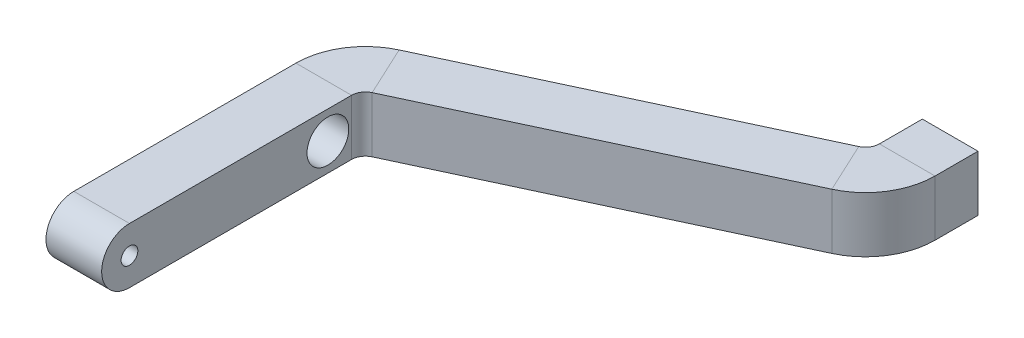
ISO-10303-21;
HEADER;
FILE_DESCRIPTION(('STEP AP214'),'2;1');
FILE_NAME('part.step','',(''),(''),'','','');
FILE_SCHEMA(('AUTOMOTIVE_DESIGN { 1 0 10303 214 1 1 1 1 }'));
ENDSEC;
DATA;
#1=APPLICATION_CONTEXT('core data for automotive mechanical design processes');
#2=APPLICATION_PROTOCOL_DEFINITION('international standard','automotive_design',2000,#1);
#3=PRODUCT_CONTEXT('',#1,'mechanical');
#4=PRODUCT('Part','Part','',(#3));
#5=PRODUCT_RELATED_PRODUCT_CATEGORY('part','',(#4));
#6=PRODUCT_DEFINITION_FORMATION('','',#4);
#7=PRODUCT_DEFINITION_CONTEXT('part definition',#1,'design');
#8=PRODUCT_DEFINITION('design','',#6,#7);
#9=PRODUCT_DEFINITION_SHAPE('','',#8);
#10=(LENGTH_UNIT() NAMED_UNIT(*) SI_UNIT(.MILLI.,.METRE.));
#11=(NAMED_UNIT(*) PLANE_ANGLE_UNIT() SI_UNIT($,.RADIAN.));
#12=(NAMED_UNIT(*) SI_UNIT($,.STERADIAN.) SOLID_ANGLE_UNIT());
#13=UNCERTAINTY_MEASURE_WITH_UNIT(LENGTH_MEASURE(1.E-05),#10,'distance_accuracy_value','');
#14=(GEOMETRIC_REPRESENTATION_CONTEXT(3) GLOBAL_UNCERTAINTY_ASSIGNED_CONTEXT((#13)) GLOBAL_UNIT_ASSIGNED_CONTEXT((#10,
#11,#12)) REPRESENTATION_CONTEXT('',''));
#15=CARTESIAN_POINT('',(0.,0.,0.));
#16=DIRECTION('',(0.,0.,1.));
#17=DIRECTION('',(1.,0.,0.));
#18=AXIS2_PLACEMENT_3D('',#15,#16,#17);
#19=CARTESIAN_POINT('',(-280.,0.,350.));
#20=DIRECTION('',(-1.,0.,0.));
#21=DIRECTION('',(0.,0.,1.));
#22=AXIS2_PLACEMENT_3D('',#19,#20,#21);
#23=CYLINDRICAL_SURFACE('',#22,20.);
#24=DIRECTION('',(-1.,0.,0.));
#25=VECTOR('',#24,1.);
#26=CARTESIAN_POINT('',(-280.,20.,350.));
#27=LINE('',#26,#25);
#28=CARTESIAN_POINT('',(-280.,20.,350.));
#29=VERTEX_POINT('',#28);
#30=CARTESIAN_POINT('',(-240.,20.,350.));
#31=VERTEX_POINT('',#30);
#32=EDGE_CURVE('E245',#29,#31,#27,.F.);
#33=ORIENTED_EDGE('',*,*,#32,.F.);
#34=CARTESIAN_POINT('',(-280.,0.,350.));
#35=DIRECTION('',(-1.,0.,0.));
#36=DIRECTION('',(0.,0.,1.));
#37=AXIS2_PLACEMENT_3D('',#34,#35,#36);
#38=CIRCLE('',#37,20.);
#39=CARTESIAN_POINT('',(-280.,-20.,350.));
#40=VERTEX_POINT('',#39);
#41=EDGE_CURVE('E46',#40,#29,#38,.T.);
#42=ORIENTED_EDGE('',*,*,#41,.F.);
#43=DIRECTION('',(-1.,0.,0.));
#44=VECTOR('',#43,1.);
#45=CARTESIAN_POINT('',(-280.,-20.,350.));
#46=LINE('',#45,#44);
#47=CARTESIAN_POINT('',(-240.,-20.,350.));
#48=VERTEX_POINT('',#47);
#49=EDGE_CURVE('E257',#48,#40,#46,.T.);
#50=ORIENTED_EDGE('',*,*,#49,.F.);
#51=CARTESIAN_POINT('',(-240.,0.,350.));
#52=DIRECTION('',(1.,0.,0.));
#53=DIRECTION('',(0.,0.,-1.));
#54=AXIS2_PLACEMENT_3D('',#51,#52,#53);
#55=CIRCLE('',#54,20.);
#56=EDGE_CURVE('E11',#31,#48,#55,.T.);
#57=ORIENTED_EDGE('',*,*,#56,.F.);
#58=EDGE_LOOP('',(#33,#42,#50,#57));
#59=FACE_BOUND('',#58,.T.);
#60=ADVANCED_FACE('F37',(#59),#23,.T.);
#61=CARTESIAN_POINT('',(0.,0.,0.));
#62=DIRECTION('',(0.,0.,1.));
#63=DIRECTION('',(1.,0.,0.));
#64=AXIS2_PLACEMENT_3D('',#61,#62,#63);
#65=PLANE('',#64);
#66=CARTESIAN_POINT('',(0.,0.,0.));
#67=DIRECTION('',(0.,0.,-1.));
#68=DIRECTION('',(-1.,0.,0.));
#69=AXIS2_PLACEMENT_3D('',#66,#67,#68);
#70=CIRCLE('',#69,10.);
#71=CARTESIAN_POINT('',(-10.,0.,0.));
#72=VERTEX_POINT('',#71);
#73=EDGE_CURVE('E269',#72,#72,#70,.T.);
#74=ORIENTED_EDGE('',*,*,#73,.F.);
#75=EDGE_LOOP('',(#74));
#76=FACE_BOUND('',#75,.T.);
#77=DIRECTION('',(0.,1.,0.));
#78=VECTOR('',#77,1.);
#79=CARTESIAN_POINT('',(20.,20.,0.));
#80=LINE('',#79,#78);
#81=CARTESIAN_POINT('',(20.,-20.,0.));
#82=VERTEX_POINT('',#81);
#83=CARTESIAN_POINT('',(20.,20.,0.));
#84=VERTEX_POINT('',#83);
#85=EDGE_CURVE('E145',#82,#84,#80,.T.);
#86=ORIENTED_EDGE('',*,*,#85,.F.);
#87=DIRECTION('',(1.,0.,0.));
#88=VECTOR('',#87,1.);
#89=CARTESIAN_POINT('',(-20.,-20.,0.));
#90=LINE('',#89,#88);
#91=CARTESIAN_POINT('',(-20.,-20.,0.));
#92=VERTEX_POINT('',#91);
#93=EDGE_CURVE('E130',#92,#82,#90,.T.);
#94=ORIENTED_EDGE('',*,*,#93,.F.);
#95=DIRECTION('',(0.,-1.,0.));
#96=VECTOR('',#95,1.);
#97=CARTESIAN_POINT('',(-20.,20.,0.));
#98=LINE('',#97,#96);
#99=CARTESIAN_POINT('',(-20.,20.,0.));
#100=VERTEX_POINT('',#99);
#101=EDGE_CURVE('E124',#100,#92,#98,.T.);
#102=ORIENTED_EDGE('',*,*,#101,.F.);
#103=DIRECTION('',(-1.,0.,0.));
#104=VECTOR('',#103,1.);
#105=CARTESIAN_POINT('',(-20.,20.,0.));
#106=LINE('',#105,#104);
#107=EDGE_CURVE('E127',#84,#100,#106,.T.);
#108=ORIENTED_EDGE('',*,*,#107,.F.);
#109=EDGE_LOOP('',(#86,#94,#102,#108));
#110=FACE_BOUND('',#109,.T.);
#111=ADVANCED_FACE('F126',(#76,#110),#65,.F.);
#112=CARTESIAN_POINT('',(-20.,20.,0.));
#113=DIRECTION('',(-1.,0.,0.));
#114=DIRECTION('',(0.,-1.,0.));
#115=AXIS2_PLACEMENT_3D('',#112,#113,#114);
#116=PLANE('',#115);
#117=DIRECTION('',(0.,0.,1.));
#118=VECTOR('',#117,1.);
#119=CARTESIAN_POINT('',(-20.,-20.,0.));
#120=LINE('',#119,#118);
#121=CARTESIAN_POINT('',(-20.,-20.,30.8878921757752));
#122=VERTEX_POINT('',#121);
#123=EDGE_CURVE('E152',#92,#122,#120,.T.);
#124=ORIENTED_EDGE('',*,*,#123,.T.);
#125=DIRECTION('',(0.,-1.,0.));
#126=VECTOR('',#125,1.);
#127=CARTESIAN_POINT('',(-20.,20.,30.8878921757752));
#128=LINE('',#127,#126);
#129=CARTESIAN_POINT('',(-20.,20.,30.8878921757752));
#130=VERTEX_POINT('',#129);
#131=EDGE_CURVE('E150',#130,#122,#128,.T.);
#132=ORIENTED_EDGE('',*,*,#131,.F.);
#133=DIRECTION('',(0.,0.,1.));
#134=VECTOR('',#133,1.);
#135=CARTESIAN_POINT('',(-20.,20.,0.));
#136=LINE('',#135,#134);
#137=EDGE_CURVE('E142',#100,#130,#136,.T.);
#138=ORIENTED_EDGE('',*,*,#137,.F.);
#139=ORIENTED_EDGE('',*,*,#101,.T.);
#140=EDGE_LOOP('',(#124,#132,#138,#139));
#141=FACE_BOUND('',#140,.T.);
#142=ADVANCED_FACE('F148',(#141),#116,.T.);
#143=CARTESIAN_POINT('',(-20.,-20.,0.));
#144=DIRECTION('',(0.,-1.,0.));
#145=DIRECTION('',(0.,0.,-1.));
#146=AXIS2_PLACEMENT_3D('',#143,#144,#145);
#147=PLANE('',#146);
#148=DIRECTION('',(0.,0.,1.));
#149=VECTOR('',#148,1.);
#150=CARTESIAN_POINT('',(20.,-20.,0.));
#151=LINE('',#150,#149);
#152=CARTESIAN_POINT('',(20.,-20.,30.8878921757752));
#153=VERTEX_POINT('',#152);
#154=EDGE_CURVE('E201',#82,#153,#151,.T.);
#155=ORIENTED_EDGE('',*,*,#154,.T.);
#156=DIRECTION('',(1.,0.,0.));
#157=VECTOR('',#156,1.);
#158=CARTESIAN_POINT('',(-20.,-20.,30.8878921757752));
#159=LINE('',#158,#157);
#160=EDGE_CURVE('E198',#122,#153,#159,.T.);
#161=ORIENTED_EDGE('',*,*,#160,.F.);
#162=ORIENTED_EDGE('',*,*,#123,.F.);
#163=ORIENTED_EDGE('',*,*,#93,.T.);
#164=EDGE_LOOP('',(#155,#161,#162,#163));
#165=FACE_BOUND('',#164,.T.);
#166=ADVANCED_FACE('F362',(#165),#147,.T.);
#167=CARTESIAN_POINT('',(20.,20.,0.));
#168=DIRECTION('',(1.,0.,0.));
#169=DIRECTION('',(0.,0.,-1.));
#170=AXIS2_PLACEMENT_3D('',#167,#168,#169);
#171=PLANE('',#170);
#172=DIRECTION('',(0.,0.,1.));
#173=VECTOR('',#172,1.);
#174=CARTESIAN_POINT('',(20.,20.,0.));
#175=LINE('',#174,#173);
#176=CARTESIAN_POINT('',(20.,20.,30.8878921757752));
#177=VERTEX_POINT('',#176);
#178=EDGE_CURVE('E144',#84,#177,#175,.T.);
#179=ORIENTED_EDGE('',*,*,#178,.T.);
#180=DIRECTION('',(0.,1.,0.));
#181=VECTOR('',#180,1.);
#182=CARTESIAN_POINT('',(20.,20.,30.8878921757752));
#183=LINE('',#182,#181);
#184=EDGE_CURVE('E204',#153,#177,#183,.T.);
#185=ORIENTED_EDGE('',*,*,#184,.F.);
#186=ORIENTED_EDGE('',*,*,#154,.F.);
#187=ORIENTED_EDGE('',*,*,#85,.T.);
#188=EDGE_LOOP('',(#179,#185,#186,#187));
#189=FACE_BOUND('',#188,.T.);
#190=ADVANCED_FACE('F352',(#189),#171,.T.);
#191=CARTESIAN_POINT('',(-20.,20.,0.));
#192=DIRECTION('',(0.,1.,0.));
#193=DIRECTION('',(0.,0.,1.));
#194=AXIS2_PLACEMENT_3D('',#191,#192,#193);
#195=PLANE('',#194);
#196=DIRECTION('',(-1.,0.,0.));
#197=VECTOR('',#196,1.);
#198=CARTESIAN_POINT('',(-20.,20.,30.8878921757752));
#199=LINE('',#198,#197);
#200=EDGE_CURVE('E166',#177,#130,#199,.T.);
#201=ORIENTED_EDGE('',*,*,#200,.F.);
#202=ORIENTED_EDGE('',*,*,#178,.F.);
#203=ORIENTED_EDGE('',*,*,#107,.T.);
#204=ORIENTED_EDGE('',*,*,#137,.T.);
#205=EDGE_LOOP('',(#201,#202,#203,#204));
#206=FACE_BOUND('',#205,.T.);
#207=ADVANCED_FACE('F141',(#206),#195,.T.);
#208=CARTESIAN_POINT('',(-30.,0.,30.8878921757752));
#209=DIRECTION('',(0.,-1.,0.));
#210=DIRECTION('',(0.,0.,-1.));
#211=AXIS2_PLACEMENT_3D('',#208,#209,#210);
#212=CYLINDRICAL_SURFACE('',#211,10.);
#213=CARTESIAN_POINT('',(-30.,-20.,30.8878921757752));
#214=DIRECTION('',(0.,-1.,0.));
#215=DIRECTION('',(1.,0.,0.));
#216=AXIS2_PLACEMENT_3D('',#213,#214,#215);
#217=CIRCLE('',#216,10.);
#218=CARTESIAN_POINT('',(-25.773817382593,-20.,39.9509700461417));
#219=VERTEX_POINT('',#218);
#220=EDGE_CURVE('E159',#122,#219,#217,.T.);
#221=ORIENTED_EDGE('',*,*,#220,.T.);
#222=DIRECTION('',(0.,-1.,0.));
#223=VECTOR('',#222,1.);
#224=CARTESIAN_POINT('',(-25.773817382593,20.,39.9509700461417));
#225=LINE('',#224,#223);
#226=CARTESIAN_POINT('',(-25.773817382593,20.,39.9509700461417));
#227=VERTEX_POINT('',#226);
#228=EDGE_CURVE('E156',#227,#219,#225,.T.);
#229=ORIENTED_EDGE('',*,*,#228,.F.);
#230=CARTESIAN_POINT('',(-30.,20.,30.8878921757752));
#231=DIRECTION('',(0.,-1.,0.));
#232=DIRECTION('',(1.,0.,0.));
#233=AXIS2_PLACEMENT_3D('',#230,#231,#232);
#234=CIRCLE('',#233,9.99999999999999);
#235=EDGE_CURVE('E160',#130,#227,#234,.T.);
#236=ORIENTED_EDGE('',*,*,#235,.F.);
#237=ORIENTED_EDGE('',*,*,#131,.T.);
#238=EDGE_LOOP('',(#221,#229,#236,#237));
#239=FACE_BOUND('',#238,.T.);
#240=ADVANCED_FACE('F351',(#239),#212,.F.);
#241=CARTESIAN_POINT('',(-20.,-20.,30.8878921757752));
#242=DIRECTION('',(0.,-1.,0.));
#243=DIRECTION('',(0.,0.,-1.));
#244=AXIS2_PLACEMENT_3D('',#241,#242,#243);
#245=PLANE('',#244);
#246=CARTESIAN_POINT('',(-30.,-20.,30.8878921757752));
#247=DIRECTION('',(0.,-1.,0.));
#248=DIRECTION('',(1.,0.,0.));
#249=AXIS2_PLACEMENT_3D('',#246,#247,#248);
#250=CIRCLE('',#249,50.);
#251=CARTESIAN_POINT('',(-8.86908691296514,-20.,76.2032815276077));
#252=VERTEX_POINT('',#251);
#253=EDGE_CURVE('E207',#153,#252,#250,.T.);
#254=ORIENTED_EDGE('',*,*,#253,.T.);
#255=DIRECTION('',(0.422618261740697,0.,0.906307787036651));
#256=VECTOR('',#255,1.);
#257=CARTESIAN_POINT('',(-25.773817382593,-20.,39.9509700461417));
#258=LINE('',#257,#256);
#259=EDGE_CURVE('E163',#219,#252,#258,.T.);
#260=ORIENTED_EDGE('',*,*,#259,.F.);
#261=ORIENTED_EDGE('',*,*,#220,.F.);
#262=ORIENTED_EDGE('',*,*,#160,.T.);
#263=EDGE_LOOP('',(#254,#260,#261,#262));
#264=FACE_BOUND('',#263,.T.);
#265=ADVANCED_FACE('F359',(#264),#245,.T.);
#266=CARTESIAN_POINT('',(-30.,0.,30.8878921757752));
#267=DIRECTION('',(0.,-1.,0.));
#268=DIRECTION('',(0.,0.,-1.));
#269=AXIS2_PLACEMENT_3D('',#266,#267,#268);
#270=CYLINDRICAL_SURFACE('',#269,50.);
#271=CARTESIAN_POINT('',(-30.,20.,30.8878921757752));
#272=DIRECTION('',(0.,-1.,0.));
#273=DIRECTION('',(1.,0.,0.));
#274=AXIS2_PLACEMENT_3D('',#271,#272,#273);
#275=CIRCLE('',#274,50.);
#276=CARTESIAN_POINT('',(-8.86908691296513,20.,76.2032815276077));
#277=VERTEX_POINT('',#276);
#278=EDGE_CURVE('E232',#177,#277,#275,.T.);
#279=ORIENTED_EDGE('',*,*,#278,.T.);
#280=DIRECTION('',(0.,1.,0.));
#281=VECTOR('',#280,1.);
#282=CARTESIAN_POINT('',(-8.86908691296514,20.,76.2032815276077));
#283=LINE('',#282,#281);
#284=EDGE_CURVE('E210',#252,#277,#283,.T.);
#285=ORIENTED_EDGE('',*,*,#284,.F.);
#286=ORIENTED_EDGE('',*,*,#253,.F.);
#287=ORIENTED_EDGE('',*,*,#184,.T.);
#288=EDGE_LOOP('',(#279,#285,#286,#287));
#289=FACE_BOUND('',#288,.T.);
#290=ADVANCED_FACE('F348',(#289),#270,.T.);
#291=CARTESIAN_POINT('',(-20.,20.,30.8878921757752));
#292=DIRECTION('',(0.,1.,0.));
#293=DIRECTION('',(0.,0.,1.));
#294=AXIS2_PLACEMENT_3D('',#291,#292,#293);
#295=PLANE('',#294);
#296=DIRECTION('',(-0.422618261740697,0.,-0.906307787036651));
#297=VECTOR('',#296,1.);
#298=CARTESIAN_POINT('',(-25.773817382593,20.,39.9509700461417));
#299=LINE('',#298,#297);
#300=EDGE_CURVE('E177',#277,#227,#299,.T.);
#301=ORIENTED_EDGE('',*,*,#300,.F.);
#302=ORIENTED_EDGE('',*,*,#278,.F.);
#303=ORIENTED_EDGE('',*,*,#200,.T.);
#304=ORIENTED_EDGE('',*,*,#235,.T.);
#305=EDGE_LOOP('',(#301,#302,#303,#304));
#306=FACE_BOUND('',#305,.T.);
#307=ADVANCED_FACE('F344',(#306),#295,.T.);
#308=CARTESIAN_POINT('',(-25.773817382593,20.,39.9509700461417));
#309=DIRECTION('',(-0.422618261740697,0.,-0.906307787036651));
#310=DIRECTION('',(-0.906307787036651,0.,0.422618261740697));
#311=AXIS2_PLACEMENT_3D('',#308,#309,#310);
#312=PLANE('',#311);
#313=DIRECTION('',(-0.906307787036651,0.,0.422618261740697));
#314=VECTOR('',#313,1.);
#315=CARTESIAN_POINT('',(-25.773817382593,-20.,39.9509700461417));
#316=LINE('',#315,#314);
#317=CARTESIAN_POINT('',(-251.130913087035,-20.,145.036709592691));
#318=VERTEX_POINT('',#317);
#319=EDGE_CURVE('E170',#219,#318,#316,.T.);
#320=ORIENTED_EDGE('',*,*,#319,.T.);
#321=DIRECTION('',(0.,-1.,0.));
#322=VECTOR('',#321,1.);
#323=CARTESIAN_POINT('',(-251.130913087035,20.,145.036709592691));
#324=LINE('',#323,#322);
#325=CARTESIAN_POINT('',(-251.130913087035,20.,145.036709592691));
#326=VERTEX_POINT('',#325);
#327=EDGE_CURVE('E167',#326,#318,#324,.T.);
#328=ORIENTED_EDGE('',*,*,#327,.F.);
#329=DIRECTION('',(-0.906307787036651,0.,0.422618261740697));
#330=VECTOR('',#329,1.);
#331=CARTESIAN_POINT('',(-25.773817382593,20.,39.9509700461417));
#332=LINE('',#331,#330);
#333=EDGE_CURVE('E171',#227,#326,#332,.T.);
#334=ORIENTED_EDGE('',*,*,#333,.F.);
#335=ORIENTED_EDGE('',*,*,#228,.T.);
#336=EDGE_LOOP('',(#320,#328,#334,#335));
#337=FACE_BOUND('',#336,.T.);
#338=ADVANCED_FACE('F347',(#337),#312,.T.);
#339=CARTESIAN_POINT('',(-25.773817382593,-20.,39.9509700461417));
#340=DIRECTION('',(0.,-1.,0.));
#341=DIRECTION('',(0.,0.,-1.));
#342=AXIS2_PLACEMENT_3D('',#339,#340,#341);
#343=PLANE('',#342);
#344=DIRECTION('',(-0.906307787036651,0.,0.422618261740697));
#345=VECTOR('',#344,1.);
#346=CARTESIAN_POINT('',(-8.86908691296514,-20.,76.2032815276077));
#347=LINE('',#346,#345);
#348=CARTESIAN_POINT('',(-234.226182617407,-20.,181.289021074157));
#349=VERTEX_POINT('',#348);
#350=EDGE_CURVE('E213',#252,#349,#347,.T.);
#351=ORIENTED_EDGE('',*,*,#350,.T.);
#352=DIRECTION('',(0.422618261740697,0.,0.906307787036651));
#353=VECTOR('',#352,1.);
#354=CARTESIAN_POINT('',(-251.130913087035,-20.,145.036709592691));
#355=LINE('',#354,#353);
#356=EDGE_CURVE('E174',#318,#349,#355,.T.);
#357=ORIENTED_EDGE('',*,*,#356,.F.);
#358=ORIENTED_EDGE('',*,*,#319,.F.);
#359=ORIENTED_EDGE('',*,*,#259,.T.);
#360=EDGE_LOOP('',(#351,#357,#358,#359));
#361=FACE_BOUND('',#360,.T.);
#362=ADVANCED_FACE('F304',(#361),#343,.T.);
#363=CARTESIAN_POINT('',(-8.86908691296515,20.,76.2032815276077));
#364=DIRECTION('',(0.422618261740697,0.,0.906307787036651));
#365=DIRECTION('',(0.906307787036651,0.,-0.422618261740697));
#366=AXIS2_PLACEMENT_3D('',#363,#364,#365);
#367=PLANE('',#366);
#368=DIRECTION('',(-0.906307787036651,0.,0.422618261740697));
#369=VECTOR('',#368,1.);
#370=CARTESIAN_POINT('',(-8.86908691296515,20.,76.2032815276077));
#371=LINE('',#370,#369);
#372=CARTESIAN_POINT('',(-234.226182617407,20.,181.289021074157));
#373=VERTEX_POINT('',#372);
#374=EDGE_CURVE('E237',#277,#373,#371,.T.);
#375=ORIENTED_EDGE('',*,*,#374,.T.);
#376=DIRECTION('',(0.,1.,0.));
#377=VECTOR('',#376,1.);
#378=CARTESIAN_POINT('',(-234.226182617407,20.,181.289021074157));
#379=LINE('',#378,#377);
#380=EDGE_CURVE('E216',#349,#373,#379,.T.);
#381=ORIENTED_EDGE('',*,*,#380,.F.);
#382=ORIENTED_EDGE('',*,*,#350,.F.);
#383=ORIENTED_EDGE('',*,*,#284,.T.);
#384=EDGE_LOOP('',(#375,#381,#382,#383));
#385=FACE_BOUND('',#384,.T.);
#386=ADVANCED_FACE('F300',(#385),#367,.T.);
#387=CARTESIAN_POINT('',(-25.773817382593,20.,39.9509700461417));
#388=DIRECTION('',(0.,1.,0.));
#389=DIRECTION('',(0.,0.,1.));
#390=AXIS2_PLACEMENT_3D('',#387,#388,#389);
#391=PLANE('',#390);
#392=DIRECTION('',(-0.422618261740697,0.,-0.906307787036651));
#393=VECTOR('',#392,1.);
#394=CARTESIAN_POINT('',(-251.130913087035,20.,145.036709592691));
#395=LINE('',#394,#393);
#396=EDGE_CURVE('E188',#373,#326,#395,.T.);
#397=ORIENTED_EDGE('',*,*,#396,.F.);
#398=ORIENTED_EDGE('',*,*,#374,.F.);
#399=ORIENTED_EDGE('',*,*,#300,.T.);
#400=ORIENTED_EDGE('',*,*,#333,.T.);
#401=EDGE_LOOP('',(#397,#398,#399,#400));
#402=FACE_BOUND('',#401,.T.);
#403=ADVANCED_FACE('F340',(#402),#391,.T.);
#404=CARTESIAN_POINT('',(-230.,0.,190.352098944524));
#405=DIRECTION('',(0.,1.,0.));
#406=DIRECTION('',(0.,0.,1.));
#407=AXIS2_PLACEMENT_3D('',#404,#405,#406);
#408=CYLINDRICAL_SURFACE('',#407,50.);
#409=CARTESIAN_POINT('',(-230.,-20.,190.352098944524));
#410=DIRECTION('',(0.,1.,0.));
#411=DIRECTION('',(-0.422618261740696,0.,-0.906307787036651));
#412=AXIS2_PLACEMENT_3D('',#409,#410,#411);
#413=CIRCLE('',#412,50.);
#414=CARTESIAN_POINT('',(-280.,-20.,190.352098944524));
#415=VERTEX_POINT('',#414);
#416=EDGE_CURVE('E181',#318,#415,#413,.T.);
#417=ORIENTED_EDGE('',*,*,#416,.T.);
#418=DIRECTION('',(0.,-1.,0.));
#419=VECTOR('',#418,1.);
#420=CARTESIAN_POINT('',(-280.,20.,190.352098944524));
#421=LINE('',#420,#419);
#422=CARTESIAN_POINT('',(-280.,20.,190.352098944524));
#423=VERTEX_POINT('',#422);
#424=EDGE_CURVE('E178',#423,#415,#421,.T.);
#425=ORIENTED_EDGE('',*,*,#424,.F.);
#426=CARTESIAN_POINT('',(-230.,20.,190.352098944524));
#427=DIRECTION('',(0.,1.,0.));
#428=DIRECTION('',(-0.422618261740696,0.,-0.906307787036651));
#429=AXIS2_PLACEMENT_3D('',#426,#427,#428);
#430=CIRCLE('',#429,50.);
#431=EDGE_CURVE('E182',#326,#423,#430,.T.);
#432=ORIENTED_EDGE('',*,*,#431,.F.);
#433=ORIENTED_EDGE('',*,*,#327,.T.);
#434=EDGE_LOOP('',(#417,#425,#432,#433));
#435=FACE_BOUND('',#434,.T.);
#436=ADVANCED_FACE('F310',(#435),#408,.T.);
#437=CARTESIAN_POINT('',(-251.130913087035,-20.,145.036709592691));
#438=DIRECTION('',(0.,-1.,0.));
#439=DIRECTION('',(0.,0.,-1.));
#440=AXIS2_PLACEMENT_3D('',#437,#438,#439);
#441=PLANE('',#440);
#442=CARTESIAN_POINT('',(-230.,-20.,190.352098944524));
#443=DIRECTION('',(0.,1.,0.));
#444=DIRECTION('',(-0.422618261740697,0.,-0.906307787036651));
#445=AXIS2_PLACEMENT_3D('',#442,#443,#444);
#446=CIRCLE('',#445,10.);
#447=CARTESIAN_POINT('',(-240.,-20.,190.352098944524));
#448=VERTEX_POINT('',#447);
#449=EDGE_CURVE('E219',#349,#448,#446,.T.);
#450=ORIENTED_EDGE('',*,*,#449,.T.);
#451=DIRECTION('',(1.,0.,0.));
#452=VECTOR('',#451,1.);
#453=CARTESIAN_POINT('',(-280.,-20.,190.352098944524));
#454=LINE('',#453,#452);
#455=EDGE_CURVE('E185',#415,#448,#454,.T.);
#456=ORIENTED_EDGE('',*,*,#455,.F.);
#457=ORIENTED_EDGE('',*,*,#416,.F.);
#458=ORIENTED_EDGE('',*,*,#356,.T.);
#459=EDGE_LOOP('',(#450,#456,#457,#458));
#460=FACE_BOUND('',#459,.T.);
#461=ADVANCED_FACE('F307',(#460),#441,.T.);
#462=CARTESIAN_POINT('',(-230.,0.,190.352098944524));
#463=DIRECTION('',(0.,1.,0.));
#464=DIRECTION('',(0.,0.,1.));
#465=AXIS2_PLACEMENT_3D('',#462,#463,#464);
#466=CYLINDRICAL_SURFACE('',#465,10.);
#467=CARTESIAN_POINT('',(-230.,20.,190.352098944524));
#468=DIRECTION('',(0.,1.,0.));
#469=DIRECTION('',(-0.422618261740696,0.,-0.906307787036652));
#470=AXIS2_PLACEMENT_3D('',#467,#468,#469);
#471=CIRCLE('',#470,10.);
#472=CARTESIAN_POINT('',(-240.,20.,190.352098944524));
#473=VERTEX_POINT('',#472);
#474=EDGE_CURVE('E242',#373,#473,#471,.T.);
#475=ORIENTED_EDGE('',*,*,#474,.T.);
#476=DIRECTION('',(0.,1.,0.));
#477=VECTOR('',#476,1.);
#478=CARTESIAN_POINT('',(-240.,20.,190.352098944524));
#479=LINE('',#478,#477);
#480=EDGE_CURVE('E222',#448,#473,#479,.T.);
#481=ORIENTED_EDGE('',*,*,#480,.F.);
#482=ORIENTED_EDGE('',*,*,#449,.F.);
#483=ORIENTED_EDGE('',*,*,#380,.T.);
#484=EDGE_LOOP('',(#475,#481,#482,#483));
#485=FACE_BOUND('',#484,.T.);
#486=ADVANCED_FACE('F297',(#485),#466,.F.);
#487=CARTESIAN_POINT('',(-251.130913087035,20.,145.036709592691));
#488=DIRECTION('',(0.,1.,0.));
#489=DIRECTION('',(0.,0.,1.));
#490=AXIS2_PLACEMENT_3D('',#487,#488,#489);
#491=PLANE('',#490);
#492=DIRECTION('',(-1.,0.,0.));
#493=VECTOR('',#492,1.);
#494=CARTESIAN_POINT('',(-280.,20.,190.352098944524));
#495=LINE('',#494,#493);
#496=EDGE_CURVE('E196',#473,#423,#495,.T.);
#497=ORIENTED_EDGE('',*,*,#496,.F.);
#498=ORIENTED_EDGE('',*,*,#474,.F.);
#499=ORIENTED_EDGE('',*,*,#396,.T.);
#500=ORIENTED_EDGE('',*,*,#431,.T.);
#501=EDGE_LOOP('',(#497,#498,#499,#500));
#502=FACE_BOUND('',#501,.T.);
#503=ADVANCED_FACE('F294',(#502),#491,.T.);
#504=CARTESIAN_POINT('',(-280.,20.,190.352098944524));
#505=DIRECTION('',(-1.,0.,0.));
#506=DIRECTION('',(0.,0.,1.));
#507=AXIS2_PLACEMENT_3D('',#504,#505,#506);
#508=PLANE('',#507);
#509=CARTESIAN_POINT('',(-280.,0.,207.352098944524));
#510=DIRECTION('',(-1.,0.,0.));
#511=DIRECTION('',(0.,0.,1.));
#512=AXIS2_PLACEMENT_3D('',#509,#510,#511);
#513=CIRCLE('',#512,15.);
#514=CARTESIAN_POINT('',(-280.,0.,222.352098944524));
#515=VERTEX_POINT('',#514);
#516=EDGE_CURVE('E274',#515,#515,#513,.T.);
#517=ORIENTED_EDGE('',*,*,#516,.F.);
#518=EDGE_LOOP('',(#517));
#519=FACE_BOUND('',#518,.T.);
#520=CARTESIAN_POINT('',(-280.,0.,350.));
#521=DIRECTION('',(-1.,0.,0.));
#522=DIRECTION('',(0.,0.,1.));
#523=AXIS2_PLACEMENT_3D('',#520,#521,#522);
#524=CIRCLE('',#523,5.99999999999999);
#525=CARTESIAN_POINT('',(-280.,0.,356.));
#526=VERTEX_POINT('',#525);
#527=EDGE_CURVE('E260',#526,#526,#524,.T.);
#528=ORIENTED_EDGE('',*,*,#527,.F.);
#529=EDGE_LOOP('',(#528));
#530=FACE_BOUND('',#529,.T.);
#531=DIRECTION('',(0.,0.,1.));
#532=VECTOR('',#531,1.);
#533=CARTESIAN_POINT('',(-280.,-20.,190.352098944524));
#534=LINE('',#533,#532);
#535=EDGE_CURVE('E189',#415,#40,#534,.T.);
#536=ORIENTED_EDGE('',*,*,#535,.T.);
#537=ORIENTED_EDGE('',*,*,#41,.T.);
#538=DIRECTION('',(0.,0.,1.));
#539=VECTOR('',#538,1.);
#540=CARTESIAN_POINT('',(-280.,20.,190.352098944524));
#541=LINE('',#540,#539);
#542=EDGE_CURVE('E193',#423,#29,#541,.T.);
#543=ORIENTED_EDGE('',*,*,#542,.F.);
#544=ORIENTED_EDGE('',*,*,#424,.T.);
#545=EDGE_LOOP('',(#536,#537,#543,#544));
#546=FACE_BOUND('',#545,.T.);
#547=ADVANCED_FACE('F313',(#519,#530,#546),#508,.T.);
#548=CARTESIAN_POINT('',(-280.,-20.,190.352098944524));
#549=DIRECTION('',(0.,-1.,0.));
#550=DIRECTION('',(0.,0.,-1.));
#551=AXIS2_PLACEMENT_3D('',#548,#549,#550);
#552=PLANE('',#551);
#553=DIRECTION('',(0.,0.,1.));
#554=VECTOR('',#553,1.);
#555=CARTESIAN_POINT('',(-240.,-20.,190.352098944524));
#556=LINE('',#555,#554);
#557=EDGE_CURVE('E192',#448,#48,#556,.T.);
#558=ORIENTED_EDGE('',*,*,#557,.T.);
#559=ORIENTED_EDGE('',*,*,#49,.T.);
#560=ORIENTED_EDGE('',*,*,#535,.F.);
#561=ORIENTED_EDGE('',*,*,#455,.T.);
#562=EDGE_LOOP('',(#558,#559,#560,#561));
#563=FACE_BOUND('',#562,.T.);
#564=ADVANCED_FACE('F287',(#563),#552,.T.);
#565=CARTESIAN_POINT('',(-240.,20.,190.352098944524));
#566=DIRECTION('',(1.,0.,0.));
#567=DIRECTION('',(0.,0.,-1.));
#568=AXIS2_PLACEMENT_3D('',#565,#566,#567);
#569=PLANE('',#568);
#570=CARTESIAN_POINT('',(-240.,0.,207.352098944524));
#571=DIRECTION('',(1.,0.,0.));
#572=DIRECTION('',(0.,0.,-1.));
#573=AXIS2_PLACEMENT_3D('',#570,#571,#572);
#574=CIRCLE('',#573,15.);
#575=CARTESIAN_POINT('',(-240.,0.,192.352098944524));
#576=VERTEX_POINT('',#575);
#577=EDGE_CURVE('E41',#576,#576,#574,.T.);
#578=ORIENTED_EDGE('',*,*,#577,.F.);
#579=EDGE_LOOP('',(#578));
#580=FACE_BOUND('',#579,.T.);
#581=CARTESIAN_POINT('',(-240.,0.,350.));
#582=DIRECTION('',(1.,0.,0.));
#583=DIRECTION('',(0.,0.,-1.));
#584=AXIS2_PLACEMENT_3D('',#581,#582,#583);
#585=CIRCLE('',#584,5.99999999999999);
#586=CARTESIAN_POINT('',(-240.,0.,344.));
#587=VERTEX_POINT('',#586);
#588=EDGE_CURVE('E135',#587,#587,#585,.T.);
#589=ORIENTED_EDGE('',*,*,#588,.F.);
#590=EDGE_LOOP('',(#589));
#591=FACE_BOUND('',#590,.T.);
#592=DIRECTION('',(0.,0.,1.));
#593=VECTOR('',#592,1.);
#594=CARTESIAN_POINT('',(-240.,20.,190.352098944524));
#595=LINE('',#594,#593);
#596=EDGE_CURVE('E225',#473,#31,#595,.T.);
#597=ORIENTED_EDGE('',*,*,#596,.T.);
#598=ORIENTED_EDGE('',*,*,#56,.T.);
#599=ORIENTED_EDGE('',*,*,#557,.F.);
#600=ORIENTED_EDGE('',*,*,#480,.T.);
#601=EDGE_LOOP('',(#597,#598,#599,#600));
#602=FACE_BOUND('',#601,.T.);
#603=ADVANCED_FACE('F283',(#580,#591,#602),#569,.T.);
#604=CARTESIAN_POINT('',(-280.,20.,190.352098944524));
#605=DIRECTION('',(0.,1.,0.));
#606=DIRECTION('',(0.,0.,1.));
#607=AXIS2_PLACEMENT_3D('',#604,#605,#606);
#608=PLANE('',#607);
#609=ORIENTED_EDGE('',*,*,#542,.T.);
#610=ORIENTED_EDGE('',*,*,#32,.T.);
#611=ORIENTED_EDGE('',*,*,#596,.F.);
#612=ORIENTED_EDGE('',*,*,#496,.T.);
#613=EDGE_LOOP('',(#609,#610,#611,#612));
#614=FACE_BOUND('',#613,.T.);
#615=ADVANCED_FACE('F286',(#614),#608,.T.);
#616=CARTESIAN_POINT('',(20.0000000000001,0.,350.));
#617=DIRECTION('',(-1.,0.,0.));
#618=DIRECTION('',(0.,0.,1.));
#619=AXIS2_PLACEMENT_3D('',#616,#617,#618);
#620=CYLINDRICAL_SURFACE('',#619,5.99999999999999);
#621=ORIENTED_EDGE('',*,*,#588,.T.);
#622=EDGE_LOOP('',(#621));
#623=FACE_BOUND('',#622,.T.);
#624=ORIENTED_EDGE('',*,*,#527,.T.);
#625=EDGE_LOOP('',(#624));
#626=FACE_BOUND('',#625,.T.);
#627=ADVANCED_FACE('F329',(#623,#626),#620,.F.);
#628=CARTESIAN_POINT('',(0.,0.,10.));
#629=DIRECTION('',(0.,0.,-1.));
#630=DIRECTION('',(-1.,0.,0.));
#631=AXIS2_PLACEMENT_3D('',#628,#629,#630);
#632=CYLINDRICAL_SURFACE('',#631,10.);
#633=CARTESIAN_POINT('',(0.,0.,10.));
#634=DIRECTION('',(0.,0.,-1.));
#635=DIRECTION('',(-1.,0.,0.));
#636=AXIS2_PLACEMENT_3D('',#633,#634,#635);
#637=CIRCLE('',#636,10.);
#638=CARTESIAN_POINT('',(-10.,0.,10.));
#639=VERTEX_POINT('',#638);
#640=EDGE_CURVE('E264',#639,#639,#637,.T.);
#641=ORIENTED_EDGE('',*,*,#640,.F.);
#642=EDGE_LOOP('',(#641));
#643=FACE_BOUND('',#642,.T.);
#644=ORIENTED_EDGE('',*,*,#73,.T.);
#645=EDGE_LOOP('',(#644));
#646=FACE_BOUND('',#645,.T.);
#647=ADVANCED_FACE('F335',(#643,#646),#632,.F.);
#648=CARTESIAN_POINT('',(0.,0.,10.));
#649=DIRECTION('',(0.,0.,-1.));
#650=DIRECTION('',(-1.,0.,0.));
#651=AXIS2_PLACEMENT_3D('',#648,#649,#650);
#652=PLANE('',#651);
#653=ORIENTED_EDGE('',*,*,#640,.T.);
#654=EDGE_LOOP('',(#653));
#655=FACE_BOUND('',#654,.T.);
#656=ADVANCED_FACE('F413',(#655),#652,.T.);
#657=CARTESIAN_POINT('',(20.0000000000001,0.,207.352098944524));
#658=DIRECTION('',(-1.,0.,0.));
#659=DIRECTION('',(0.,0.,1.));
#660=AXIS2_PLACEMENT_3D('',#657,#658,#659);
#661=CYLINDRICAL_SURFACE('',#660,15.);
#662=ORIENTED_EDGE('',*,*,#577,.T.);
#663=EDGE_LOOP('',(#662));
#664=FACE_BOUND('',#663,.T.);
#665=ORIENTED_EDGE('',*,*,#516,.T.);
#666=EDGE_LOOP('',(#665));
#667=FACE_BOUND('',#666,.T.);
#668=ADVANCED_FACE('F281',(#664,#667),#661,.F.);
#669=CLOSED_SHELL('',(#60,#111,#142,#166,#190,#207,#240,#265,#290,#307,#338,#362,#386,#403,#436,
#461,#486,#503,#547,#564,#603,#615,#627,#647,#656,#668));
#670=MANIFOLD_SOLID_BREP('B2',#669);
#671=ADVANCED_BREP_SHAPE_REPRESENTATION('',(#18,#670),#14);
#672=SHAPE_DEFINITION_REPRESENTATION(#9,#671);
ENDSEC;
END-ISO-10303-21;
